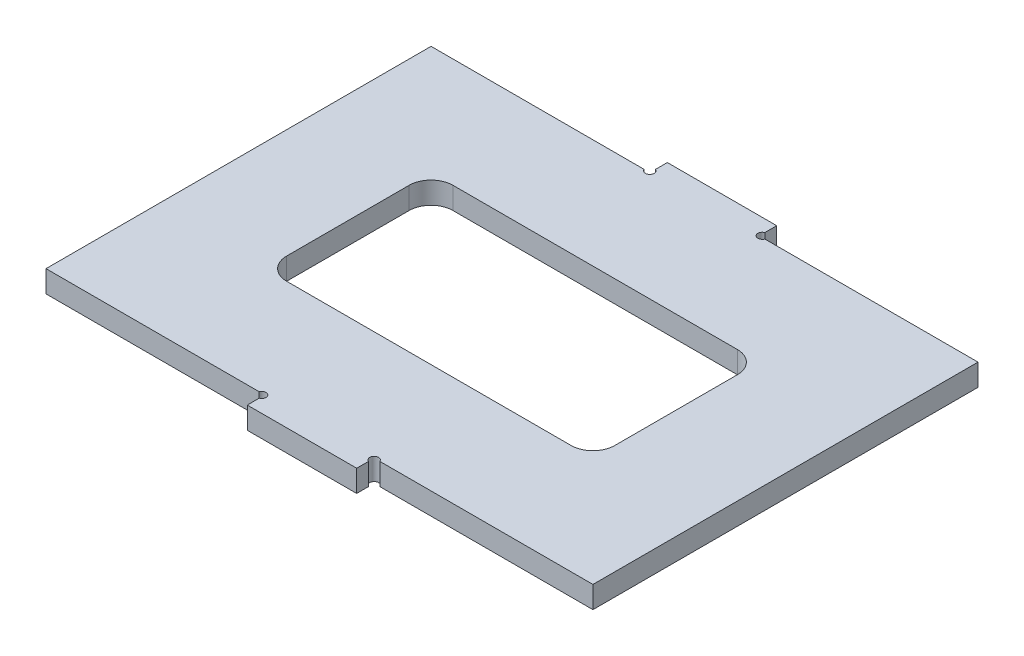
ISO-10303-21;
HEADER;
FILE_DESCRIPTION(('STEP AP214'),'2;1');
FILE_NAME('part.step','',(''),(''),'','','');
FILE_SCHEMA(('AUTOMOTIVE_DESIGN { 1 0 10303 214 1 1 1 1 }'));
ENDSEC;
DATA;
#1=APPLICATION_CONTEXT('core data for automotive mechanical design processes');
#2=APPLICATION_PROTOCOL_DEFINITION('international standard','automotive_design',2000,#1);
#3=PRODUCT_CONTEXT('',#1,'mechanical');
#4=PRODUCT('Part','Part','',(#3));
#5=PRODUCT_RELATED_PRODUCT_CATEGORY('part','',(#4));
#6=PRODUCT_DEFINITION_FORMATION('','',#4);
#7=PRODUCT_DEFINITION_CONTEXT('part definition',#1,'design');
#8=PRODUCT_DEFINITION('design','',#6,#7);
#9=PRODUCT_DEFINITION_SHAPE('','',#8);
#10=(LENGTH_UNIT() NAMED_UNIT(*) SI_UNIT(.MILLI.,.METRE.));
#11=(NAMED_UNIT(*) PLANE_ANGLE_UNIT() SI_UNIT($,.RADIAN.));
#12=(NAMED_UNIT(*) SI_UNIT($,.STERADIAN.) SOLID_ANGLE_UNIT());
#13=UNCERTAINTY_MEASURE_WITH_UNIT(LENGTH_MEASURE(1.E-05),#10,'distance_accuracy_value','');
#14=(GEOMETRIC_REPRESENTATION_CONTEXT(3) GLOBAL_UNCERTAINTY_ASSIGNED_CONTEXT((#13)) GLOBAL_UNIT_ASSIGNED_CONTEXT((#10,
#11,#12)) REPRESENTATION_CONTEXT('',''));
#15=CARTESIAN_POINT('',(0.,0.,0.));
#16=DIRECTION('',(0.,0.,1.));
#17=DIRECTION('',(1.,0.,0.));
#18=AXIS2_PLACEMENT_3D('',#15,#16,#17);
#19=CARTESIAN_POINT('',(-125.,-10.,88.));
#20=DIRECTION('',(0.,0.,1.));
#21=DIRECTION('',(1.,0.,0.));
#22=AXIS2_PLACEMENT_3D('',#19,#20,#21);
#23=PLANE('',#22);
#24=DIRECTION('',(1.,0.,0.));
#25=VECTOR('',#24,1.);
#26=CARTESIAN_POINT('',(-125.,-10.,88.));
#27=LINE('',#26,#25);
#28=CARTESIAN_POINT('',(-125.,-10.,88.));
#29=VERTEX_POINT('',#28);
#30=CARTESIAN_POINT('',(-27.5779354745736,-10.,88.));
#31=VERTEX_POINT('',#30);
#32=EDGE_CURVE('E248',#29,#31,#27,.T.);
#33=ORIENTED_EDGE('',*,*,#32,.T.);
#34=DIRECTION('',(0.,1.,0.));
#35=VECTOR('',#34,1.);
#36=CARTESIAN_POINT('',(-27.5779354745736,0.,88.));
#37=LINE('',#36,#35);
#38=CARTESIAN_POINT('',(-27.5779354745736,0.,88.));
#39=VERTEX_POINT('',#38);
#40=EDGE_CURVE('E314',#39,#31,#37,.F.);
#41=ORIENTED_EDGE('',*,*,#40,.F.);
#42=DIRECTION('',(1.,0.,0.));
#43=VECTOR('',#42,1.);
#44=CARTESIAN_POINT('',(-125.,0.,88.));
#45=LINE('',#44,#43);
#46=CARTESIAN_POINT('',(-125.,0.,88.));
#47=VERTEX_POINT('',#46);
#48=EDGE_CURVE('E229',#47,#39,#45,.T.);
#49=ORIENTED_EDGE('',*,*,#48,.F.);
#50=DIRECTION('',(0.,1.,0.));
#51=VECTOR('',#50,1.);
#52=CARTESIAN_POINT('',(-125.,-10.,88.));
#53=LINE('',#52,#51);
#54=EDGE_CURVE('E241',#29,#47,#53,.T.);
#55=ORIENTED_EDGE('',*,*,#54,.F.);
#56=EDGE_LOOP('',(#33,#41,#49,#55));
#57=FACE_BOUND('',#56,.T.);
#58=ADVANCED_FACE('F42',(#57),#23,.T.);
#59=CARTESIAN_POINT('',(-125.,-10.,-88.));
#60=DIRECTION('',(0.,0.,-1.));
#61=DIRECTION('',(-1.,0.,0.));
#62=AXIS2_PLACEMENT_3D('',#59,#60,#61);
#63=PLANE('',#62);
#64=DIRECTION('',(-1.,0.,0.));
#65=VECTOR('',#64,1.);
#66=CARTESIAN_POINT('',(-125.,-10.,-88.));
#67=LINE('',#66,#65);
#68=CARTESIAN_POINT('',(125.,-10.,-88.));
#69=VERTEX_POINT('',#68);
#70=CARTESIAN_POINT('',(27.5779354745735,-10.,-88.));
#71=VERTEX_POINT('',#70);
#72=EDGE_CURVE('E386',#69,#71,#67,.T.);
#73=ORIENTED_EDGE('',*,*,#72,.T.);
#74=DIRECTION('',(0.,1.,0.));
#75=VECTOR('',#74,1.);
#76=CARTESIAN_POINT('',(27.5779354745735,0.,-88.));
#77=LINE('',#76,#75);
#78=CARTESIAN_POINT('',(27.5779354745735,0.,-88.));
#79=VERTEX_POINT('',#78);
#80=EDGE_CURVE('E340',#79,#71,#77,.F.);
#81=ORIENTED_EDGE('',*,*,#80,.F.);
#82=DIRECTION('',(-1.,0.,0.));
#83=VECTOR('',#82,1.);
#84=CARTESIAN_POINT('',(-125.,0.,-88.));
#85=LINE('',#84,#83);
#86=CARTESIAN_POINT('',(125.,0.,-88.));
#87=VERTEX_POINT('',#86);
#88=EDGE_CURVE('E235',#87,#79,#85,.T.);
#89=ORIENTED_EDGE('',*,*,#88,.F.);
#90=DIRECTION('',(0.,1.,0.));
#91=VECTOR('',#90,1.);
#92=CARTESIAN_POINT('',(125.,-10.,-88.));
#93=LINE('',#92,#91);
#94=EDGE_CURVE('E246',#69,#87,#93,.T.);
#95=ORIENTED_EDGE('',*,*,#94,.F.);
#96=EDGE_LOOP('',(#73,#81,#89,#95));
#97=FACE_BOUND('',#96,.T.);
#98=ADVANCED_FACE('F436',(#97),#63,.T.);
#99=CARTESIAN_POINT('',(27.5779354745735,0.,88.));
#100=VERTEX_POINT('',#99);
#101=CARTESIAN_POINT('',(125.,0.,88.));
#102=VERTEX_POINT('',#101);
#103=EDGE_CURVE('E219',#100,#102,#45,.T.);
#104=ORIENTED_EDGE('',*,*,#103,.F.);
#105=DIRECTION('',(0.,-1.,0.));
#106=VECTOR('',#105,1.);
#107=CARTESIAN_POINT('',(27.5779354745736,-10.,88.));
#108=LINE('',#107,#106);
#109=CARTESIAN_POINT('',(27.5779354745736,-10.,88.));
#110=VERTEX_POINT('',#109);
#111=EDGE_CURVE('E202',#110,#100,#108,.F.);
#112=ORIENTED_EDGE('',*,*,#111,.F.);
#113=CARTESIAN_POINT('',(125.,-10.,88.));
#114=VERTEX_POINT('',#113);
#115=EDGE_CURVE('E392',#110,#114,#27,.T.);
#116=ORIENTED_EDGE('',*,*,#115,.T.);
#117=DIRECTION('',(0.,1.,0.));
#118=VECTOR('',#117,1.);
#119=CARTESIAN_POINT('',(125.,-10.,88.));
#120=LINE('',#119,#118);
#121=EDGE_CURVE('E227',#114,#102,#120,.T.);
#122=ORIENTED_EDGE('',*,*,#121,.T.);
#123=EDGE_LOOP('',(#104,#112,#116,#122));
#124=FACE_BOUND('',#123,.T.);
#125=ADVANCED_FACE('F225',(#124),#23,.T.);
#126=CARTESIAN_POINT('',(-27.5779354745736,0.,-88.));
#127=VERTEX_POINT('',#126);
#128=CARTESIAN_POINT('',(-125.,0.,-88.));
#129=VERTEX_POINT('',#128);
#130=EDGE_CURVE('E395',#127,#129,#85,.T.);
#131=ORIENTED_EDGE('',*,*,#130,.F.);
#132=DIRECTION('',(0.,-1.,0.));
#133=VECTOR('',#132,1.);
#134=CARTESIAN_POINT('',(-27.5779354745736,-10.,-88.));
#135=LINE('',#134,#133);
#136=CARTESIAN_POINT('',(-27.5779354745736,-10.,-88.));
#137=VERTEX_POINT('',#136);
#138=EDGE_CURVE('E329',#137,#127,#135,.F.);
#139=ORIENTED_EDGE('',*,*,#138,.F.);
#140=CARTESIAN_POINT('',(-125.,-10.,-88.));
#141=VERTEX_POINT('',#140);
#142=EDGE_CURVE('E385',#137,#141,#67,.T.);
#143=ORIENTED_EDGE('',*,*,#142,.T.);
#144=DIRECTION('',(0.,1.,0.));
#145=VECTOR('',#144,1.);
#146=CARTESIAN_POINT('',(-125.,-10.,-88.));
#147=LINE('',#146,#145);
#148=EDGE_CURVE('E243',#141,#129,#147,.T.);
#149=ORIENTED_EDGE('',*,*,#148,.T.);
#150=EDGE_LOOP('',(#131,#139,#143,#149));
#151=FACE_BOUND('',#150,.T.);
#152=ADVANCED_FACE('F406',(#151),#63,.T.);
#153=CARTESIAN_POINT('',(-25.,-10.,-88.));
#154=DIRECTION('',(-1.,0.,0.));
#155=DIRECTION('',(0.,0.,1.));
#156=AXIS2_PLACEMENT_3D('',#153,#154,#155);
#157=PLANE('',#156);
#158=DIRECTION('',(0.,0.,1.));
#159=VECTOR('',#158,1.);
#160=CARTESIAN_POINT('',(-25.,-10.,-88.));
#161=LINE('',#160,#159);
#162=CARTESIAN_POINT('',(-25.,-10.,-96.));
#163=VERTEX_POINT('',#162);
#164=CARTESIAN_POINT('',(-25.,-10.,-90.5779354745735));
#165=VERTEX_POINT('',#164);
#166=EDGE_CURVE('E363',#163,#165,#161,.T.);
#167=ORIENTED_EDGE('',*,*,#166,.T.);
#168=DIRECTION('',(0.,-1.,0.));
#169=VECTOR('',#168,1.);
#170=CARTESIAN_POINT('',(-25.,-10.,-90.5779354745735));
#171=LINE('',#170,#169);
#172=CARTESIAN_POINT('',(-25.,0.,-90.5779354745735));
#173=VERTEX_POINT('',#172);
#174=EDGE_CURVE('E323',#165,#173,#171,.F.);
#175=ORIENTED_EDGE('',*,*,#174,.T.);
#176=DIRECTION('',(0.,0.,1.));
#177=VECTOR('',#176,1.);
#178=CARTESIAN_POINT('',(-25.,0.,-88.));
#179=LINE('',#178,#177);
#180=CARTESIAN_POINT('',(-25.,0.,-96.));
#181=VERTEX_POINT('',#180);
#182=EDGE_CURVE('E356',#181,#173,#179,.T.);
#183=ORIENTED_EDGE('',*,*,#182,.F.);
#184=DIRECTION('',(0.,1.,0.));
#185=VECTOR('',#184,1.);
#186=CARTESIAN_POINT('',(-25.,-10.,-96.));
#187=LINE('',#186,#185);
#188=EDGE_CURVE('E378',#163,#181,#187,.T.);
#189=ORIENTED_EDGE('',*,*,#188,.F.);
#190=EDGE_LOOP('',(#167,#175,#183,#189));
#191=FACE_BOUND('',#190,.T.);
#192=ADVANCED_FACE('F451',(#191),#157,.T.);
#193=CARTESIAN_POINT('',(25.,-10.,-88.));
#194=DIRECTION('',(1.,0.,0.));
#195=DIRECTION('',(0.,0.,-1.));
#196=AXIS2_PLACEMENT_3D('',#193,#194,#195);
#197=PLANE('',#196);
#198=DIRECTION('',(0.,0.,-1.));
#199=VECTOR('',#198,1.);
#200=CARTESIAN_POINT('',(25.,0.,-88.));
#201=LINE('',#200,#199);
#202=CARTESIAN_POINT('',(25.,0.,-90.5779354745735));
#203=VERTEX_POINT('',#202);
#204=CARTESIAN_POINT('',(25.,0.,-96.));
#205=VERTEX_POINT('',#204);
#206=EDGE_CURVE('E374',#203,#205,#201,.T.);
#207=ORIENTED_EDGE('',*,*,#206,.F.);
#208=DIRECTION('',(0.,1.,0.));
#209=VECTOR('',#208,1.);
#210=CARTESIAN_POINT('',(25.,0.,-90.5779354745735));
#211=LINE('',#210,#209);
#212=CARTESIAN_POINT('',(25.,-10.,-90.5779354745735));
#213=VERTEX_POINT('',#212);
#214=EDGE_CURVE('E338',#203,#213,#211,.F.);
#215=ORIENTED_EDGE('',*,*,#214,.T.);
#216=DIRECTION('',(0.,0.,-1.));
#217=VECTOR('',#216,1.);
#218=CARTESIAN_POINT('',(25.,-10.,-88.));
#219=LINE('',#218,#217);
#220=CARTESIAN_POINT('',(25.,-10.,-96.));
#221=VERTEX_POINT('',#220);
#222=EDGE_CURVE('E366',#213,#221,#219,.T.);
#223=ORIENTED_EDGE('',*,*,#222,.T.);
#224=DIRECTION('',(0.,1.,0.));
#225=VECTOR('',#224,1.);
#226=CARTESIAN_POINT('',(25.,-10.,-96.));
#227=LINE('',#226,#225);
#228=EDGE_CURVE('E372',#221,#205,#227,.T.);
#229=ORIENTED_EDGE('',*,*,#228,.T.);
#230=EDGE_LOOP('',(#207,#215,#223,#229));
#231=FACE_BOUND('',#230,.T.);
#232=ADVANCED_FACE('F445',(#231),#197,.T.);
#233=CARTESIAN_POINT('',(25.0000000000001,-10.,88.));
#234=DIRECTION('',(1.,0.,0.));
#235=DIRECTION('',(0.,0.,-1.));
#236=AXIS2_PLACEMENT_3D('',#233,#234,#235);
#237=PLANE('',#236);
#238=DIRECTION('',(0.,0.,-1.));
#239=VECTOR('',#238,1.);
#240=CARTESIAN_POINT('',(25.0000000000001,-10.,88.));
#241=LINE('',#240,#239);
#242=CARTESIAN_POINT('',(25.,-10.,96.));
#243=VERTEX_POINT('',#242);
#244=CARTESIAN_POINT('',(25.,-10.,90.5779354745735));
#245=VERTEX_POINT('',#244);
#246=EDGE_CURVE('E348',#243,#245,#241,.T.);
#247=ORIENTED_EDGE('',*,*,#246,.T.);
#248=DIRECTION('',(0.,-1.,0.));
#249=VECTOR('',#248,1.);
#250=CARTESIAN_POINT('',(25.,-10.,90.5779354745735));
#251=LINE('',#250,#249);
#252=CARTESIAN_POINT('',(25.,0.,90.5779354745735));
#253=VERTEX_POINT('',#252);
#254=EDGE_CURVE('E212',#245,#253,#251,.F.);
#255=ORIENTED_EDGE('',*,*,#254,.T.);
#256=DIRECTION('',(0.,0.,-1.));
#257=VECTOR('',#256,1.);
#258=CARTESIAN_POINT('',(25.0000000000001,0.,88.));
#259=LINE('',#258,#257);
#260=CARTESIAN_POINT('',(25.,0.,96.));
#261=VERTEX_POINT('',#260);
#262=EDGE_CURVE('E223',#261,#253,#259,.T.);
#263=ORIENTED_EDGE('',*,*,#262,.F.);
#264=DIRECTION('',(0.,1.,0.));
#265=VECTOR('',#264,1.);
#266=CARTESIAN_POINT('',(25.,-10.,96.));
#267=LINE('',#266,#265);
#268=EDGE_CURVE('E342',#243,#261,#267,.T.);
#269=ORIENTED_EDGE('',*,*,#268,.F.);
#270=EDGE_LOOP('',(#247,#255,#263,#269));
#271=FACE_BOUND('',#270,.T.);
#272=ADVANCED_FACE('F426',(#271),#237,.T.);
#273=CARTESIAN_POINT('',(-25.,-10.,88.));
#274=DIRECTION('',(-1.,0.,0.));
#275=DIRECTION('',(0.,0.,1.));
#276=AXIS2_PLACEMENT_3D('',#273,#274,#275);
#277=PLANE('',#276);
#278=DIRECTION('',(0.,0.,1.));
#279=VECTOR('',#278,1.);
#280=CARTESIAN_POINT('',(-25.,0.,88.));
#281=LINE('',#280,#279);
#282=CARTESIAN_POINT('',(-25.,0.,90.5779354745735));
#283=VERTEX_POINT('',#282);
#284=CARTESIAN_POINT('',(-25.,0.,96.));
#285=VERTEX_POINT('',#284);
#286=EDGE_CURVE('E354',#283,#285,#281,.T.);
#287=ORIENTED_EDGE('',*,*,#286,.F.);
#288=DIRECTION('',(0.,1.,0.));
#289=VECTOR('',#288,1.);
#290=CARTESIAN_POINT('',(-25.,0.,90.5779354745735));
#291=LINE('',#290,#289);
#292=CARTESIAN_POINT('',(-25.,-10.,90.5779354745735));
#293=VERTEX_POINT('',#292);
#294=EDGE_CURVE('E320',#283,#293,#291,.F.);
#295=ORIENTED_EDGE('',*,*,#294,.T.);
#296=DIRECTION('',(0.,0.,1.));
#297=VECTOR('',#296,1.);
#298=CARTESIAN_POINT('',(-25.,-10.,88.));
#299=LINE('',#298,#297);
#300=CARTESIAN_POINT('',(-25.,-10.,96.));
#301=VERTEX_POINT('',#300);
#302=EDGE_CURVE('E352',#293,#301,#299,.T.);
#303=ORIENTED_EDGE('',*,*,#302,.T.);
#304=DIRECTION('',(0.,1.,0.));
#305=VECTOR('',#304,1.);
#306=CARTESIAN_POINT('',(-25.,-10.,96.));
#307=LINE('',#306,#305);
#308=EDGE_CURVE('E345',#301,#285,#307,.T.);
#309=ORIENTED_EDGE('',*,*,#308,.T.);
#310=EDGE_LOOP('',(#287,#295,#303,#309));
#311=FACE_BOUND('',#310,.T.);
#312=ADVANCED_FACE('F418',(#311),#277,.T.);
#313=CARTESIAN_POINT('',(125.,-10.,-88.));
#314=DIRECTION('',(1.,0.,0.));
#315=DIRECTION('',(0.,0.,-1.));
#316=AXIS2_PLACEMENT_3D('',#313,#314,#315);
#317=PLANE('',#316);
#318=DIRECTION('',(0.,0.,-1.));
#319=VECTOR('',#318,1.);
#320=CARTESIAN_POINT('',(125.,0.,-88.));
#321=LINE('',#320,#319);
#322=EDGE_CURVE('E380',#102,#87,#321,.T.);
#323=ORIENTED_EDGE('',*,*,#322,.F.);
#324=ORIENTED_EDGE('',*,*,#121,.F.);
#325=DIRECTION('',(0.,0.,-1.));
#326=VECTOR('',#325,1.);
#327=CARTESIAN_POINT('',(125.,-10.,-88.));
#328=LINE('',#327,#326);
#329=EDGE_CURVE('E233',#114,#69,#328,.T.);
#330=ORIENTED_EDGE('',*,*,#329,.T.);
#331=ORIENTED_EDGE('',*,*,#94,.T.);
#332=EDGE_LOOP('',(#323,#324,#330,#331));
#333=FACE_BOUND('',#332,.T.);
#334=ADVANCED_FACE('F433',(#333),#317,.T.);
#335=CARTESIAN_POINT('',(-125.,-10.,-88.));
#336=DIRECTION('',(-1.,0.,0.));
#337=DIRECTION('',(0.,0.,1.));
#338=AXIS2_PLACEMENT_3D('',#335,#336,#337);
#339=PLANE('',#338);
#340=DIRECTION('',(0.,0.,1.));
#341=VECTOR('',#340,1.);
#342=CARTESIAN_POINT('',(-125.,0.,-88.));
#343=LINE('',#342,#341);
#344=EDGE_CURVE('E230',#129,#47,#343,.T.);
#345=ORIENTED_EDGE('',*,*,#344,.F.);
#346=ORIENTED_EDGE('',*,*,#148,.F.);
#347=DIRECTION('',(0.,0.,1.));
#348=VECTOR('',#347,1.);
#349=CARTESIAN_POINT('',(-125.,-10.,-88.));
#350=LINE('',#349,#348);
#351=EDGE_CURVE('E389',#141,#29,#350,.T.);
#352=ORIENTED_EDGE('',*,*,#351,.T.);
#353=ORIENTED_EDGE('',*,*,#54,.T.);
#354=EDGE_LOOP('',(#345,#346,#352,#353));
#355=FACE_BOUND('',#354,.T.);
#356=ADVANCED_FACE('F410',(#355),#339,.T.);
#357=CARTESIAN_POINT('',(0.,-10.,0.));
#358=DIRECTION('',(0.,1.,0.));
#359=DIRECTION('',(0.,0.,1.));
#360=AXIS2_PLACEMENT_3D('',#357,#358,#359);
#361=PLANE('',#360);
#362=DIRECTION('',(0.,0.,-1.));
#363=VECTOR('',#362,1.);
#364=CARTESIAN_POINT('',(75.,-10.,-38.));
#365=LINE('',#364,#363);
#366=CARTESIAN_POINT('',(75.,-10.,27.9999999999999));
#367=VERTEX_POINT('',#366);
#368=CARTESIAN_POINT('',(75.,-10.,-28.));
#369=VERTEX_POINT('',#368);
#370=EDGE_CURVE('E299',#367,#369,#365,.T.);
#371=ORIENTED_EDGE('',*,*,#370,.T.);
#372=CARTESIAN_POINT('',(65.,-10.,-28.));
#373=DIRECTION('',(0.,1.,0.));
#374=DIRECTION('',(0.,0.,1.));
#375=AXIS2_PLACEMENT_3D('',#372,#373,#374);
#376=CIRCLE('',#375,10.);
#377=CARTESIAN_POINT('',(65.,-10.,-38.));
#378=VERTEX_POINT('',#377);
#379=EDGE_CURVE('E269',#369,#378,#376,.T.);
#380=ORIENTED_EDGE('',*,*,#379,.T.);
#381=DIRECTION('',(-1.,0.,0.));
#382=VECTOR('',#381,1.);
#383=CARTESIAN_POINT('',(75.,-10.,-38.));
#384=LINE('',#383,#382);
#385=CARTESIAN_POINT('',(-65.,-10.,-38.));
#386=VERTEX_POINT('',#385);
#387=EDGE_CURVE('E304',#378,#386,#384,.T.);
#388=ORIENTED_EDGE('',*,*,#387,.T.);
#389=CARTESIAN_POINT('',(-65.0000000000001,-10.,-28.));
#390=DIRECTION('',(0.,1.,0.));
#391=DIRECTION('',(0.,0.,1.));
#392=AXIS2_PLACEMENT_3D('',#389,#390,#391);
#393=CIRCLE('',#392,10.);
#394=CARTESIAN_POINT('',(-75.0000000000001,-10.,-28.));
#395=VERTEX_POINT('',#394);
#396=EDGE_CURVE('E11',#386,#395,#393,.T.);
#397=ORIENTED_EDGE('',*,*,#396,.T.);
#398=DIRECTION('',(0.,0.,1.));
#399=VECTOR('',#398,1.);
#400=CARTESIAN_POINT('',(-75.0000000000001,-10.,-38.));
#401=LINE('',#400,#399);
#402=CARTESIAN_POINT('',(-75.0000000000001,-10.,27.9999999999999));
#403=VERTEX_POINT('',#402);
#404=EDGE_CURVE('E291',#395,#403,#401,.T.);
#405=ORIENTED_EDGE('',*,*,#404,.T.);
#406=CARTESIAN_POINT('',(-65.,-10.,28.));
#407=DIRECTION('',(0.,1.,0.));
#408=DIRECTION('',(0.,0.,1.));
#409=AXIS2_PLACEMENT_3D('',#406,#407,#408);
#410=CIRCLE('',#409,10.);
#411=CARTESIAN_POINT('',(-65.,-10.,38.));
#412=VERTEX_POINT('',#411);
#413=EDGE_CURVE('E277',#403,#412,#410,.T.);
#414=ORIENTED_EDGE('',*,*,#413,.T.);
#415=DIRECTION('',(1.,0.,0.));
#416=VECTOR('',#415,1.);
#417=CARTESIAN_POINT('',(75.,-10.,38.));
#418=LINE('',#417,#416);
#419=CARTESIAN_POINT('',(65.,-10.,38.));
#420=VERTEX_POINT('',#419);
#421=EDGE_CURVE('E296',#412,#420,#418,.T.);
#422=ORIENTED_EDGE('',*,*,#421,.T.);
#423=CARTESIAN_POINT('',(65.,-10.,28.));
#424=DIRECTION('',(0.,1.,0.));
#425=DIRECTION('',(0.,0.,1.));
#426=AXIS2_PLACEMENT_3D('',#423,#424,#425);
#427=CIRCLE('',#426,10.);
#428=EDGE_CURVE('E273',#420,#367,#427,.T.);
#429=ORIENTED_EDGE('',*,*,#428,.T.);
#430=EDGE_LOOP('',(#371,#380,#388,#397,#405,#414,#422,#429));
#431=FACE_BOUND('',#430,.T.);
#432=CARTESIAN_POINT('',(-25.7071067811866,-10.,-88.7071067811865));
#433=DIRECTION('',(0.,1.,0.));
#434=DIRECTION('',(0.,0.,-1.));
#435=AXIS2_PLACEMENT_3D('',#432,#433,#434);
#436=CIRCLE('',#435,2.);
#437=EDGE_CURVE('E306',#137,#165,#436,.T.);
#438=ORIENTED_EDGE('',*,*,#437,.T.);
#439=ORIENTED_EDGE('',*,*,#166,.F.);
#440=DIRECTION('',(-1.,0.,0.));
#441=VECTOR('',#440,1.);
#442=CARTESIAN_POINT('',(-25.,-10.,-96.));
#443=LINE('',#442,#441);
#444=EDGE_CURVE('E369',#221,#163,#443,.T.);
#445=ORIENTED_EDGE('',*,*,#444,.F.);
#446=ORIENTED_EDGE('',*,*,#222,.F.);
#447=CARTESIAN_POINT('',(25.7071067811866,-10.,-88.7071067811865));
#448=DIRECTION('',(0.,1.,0.));
#449=DIRECTION('',(0.,0.,1.));
#450=AXIS2_PLACEMENT_3D('',#447,#448,#449);
#451=CIRCLE('',#450,2.);
#452=EDGE_CURVE('E335',#213,#71,#451,.T.);
#453=ORIENTED_EDGE('',*,*,#452,.T.);
#454=ORIENTED_EDGE('',*,*,#72,.F.);
#455=ORIENTED_EDGE('',*,*,#329,.F.);
#456=ORIENTED_EDGE('',*,*,#115,.F.);
#457=CARTESIAN_POINT('',(25.7071067811866,-10.,88.7071067811865));
#458=DIRECTION('',(0.,1.,0.));
#459=DIRECTION('',(0.,0.,-1.));
#460=AXIS2_PLACEMENT_3D('',#457,#458,#459);
#461=CIRCLE('',#460,2.);
#462=EDGE_CURVE('E208',#110,#245,#461,.T.);
#463=ORIENTED_EDGE('',*,*,#462,.T.);
#464=ORIENTED_EDGE('',*,*,#246,.F.);
#465=DIRECTION('',(1.,0.,0.));
#466=VECTOR('',#465,1.);
#467=CARTESIAN_POINT('',(-25.,-10.,96.));
#468=LINE('',#467,#466);
#469=EDGE_CURVE('E359',#301,#243,#468,.T.);
#470=ORIENTED_EDGE('',*,*,#469,.F.);
#471=ORIENTED_EDGE('',*,*,#302,.F.);
#472=CARTESIAN_POINT('',(-25.7071067811866,-10.,88.7071067811865));
#473=DIRECTION('',(0.,1.,0.));
#474=DIRECTION('',(0.,0.,1.));
#475=AXIS2_PLACEMENT_3D('',#472,#473,#474);
#476=CIRCLE('',#475,2.);
#477=EDGE_CURVE('E317',#293,#31,#476,.T.);
#478=ORIENTED_EDGE('',*,*,#477,.T.);
#479=ORIENTED_EDGE('',*,*,#32,.F.);
#480=ORIENTED_EDGE('',*,*,#351,.F.);
#481=ORIENTED_EDGE('',*,*,#142,.F.);
#482=EDGE_LOOP('',(#438,#439,#445,#446,#453,#454,#455,#456,#463,#464,#470,#471,#478,#479,#480,#481));
#483=FACE_BOUND('',#482,.T.);
#484=ADVANCED_FACE('F429',(#431,#483),#361,.F.);
#485=CARTESIAN_POINT('',(0.,0.,0.));
#486=DIRECTION('',(0.,1.,0.));
#487=DIRECTION('',(0.,0.,1.));
#488=AXIS2_PLACEMENT_3D('',#485,#486,#487);
#489=PLANE('',#488);
#490=DIRECTION('',(0.,0.,1.));
#491=VECTOR('',#490,1.);
#492=CARTESIAN_POINT('',(-75.0000000000001,0.,-38.));
#493=LINE('',#492,#491);
#494=CARTESIAN_POINT('',(-75.0000000000001,0.,-28.));
#495=VERTEX_POINT('',#494);
#496=CARTESIAN_POINT('',(-75.0000000000001,0.,27.9999999999999));
#497=VERTEX_POINT('',#496);
#498=EDGE_CURVE('E283',#495,#497,#493,.T.);
#499=ORIENTED_EDGE('',*,*,#498,.F.);
#500=CARTESIAN_POINT('',(-65.0000000000001,0.,-28.));
#501=DIRECTION('',(0.,1.,0.));
#502=DIRECTION('',(0.,0.,1.));
#503=AXIS2_PLACEMENT_3D('',#500,#501,#502);
#504=CIRCLE('',#503,10.);
#505=CARTESIAN_POINT('',(-65.,0.,-38.));
#506=VERTEX_POINT('',#505);
#507=EDGE_CURVE('E50',#495,#506,#504,.F.);
#508=ORIENTED_EDGE('',*,*,#507,.T.);
#509=DIRECTION('',(-1.,0.,0.));
#510=VECTOR('',#509,1.);
#511=CARTESIAN_POINT('',(75.,0.,-38.));
#512=LINE('',#511,#510);
#513=CARTESIAN_POINT('',(65.,0.,-38.));
#514=VERTEX_POINT('',#513);
#515=EDGE_CURVE('E282',#514,#506,#512,.T.);
#516=ORIENTED_EDGE('',*,*,#515,.F.);
#517=CARTESIAN_POINT('',(65.,0.,-28.));
#518=DIRECTION('',(0.,1.,0.));
#519=DIRECTION('',(0.,0.,1.));
#520=AXIS2_PLACEMENT_3D('',#517,#518,#519);
#521=CIRCLE('',#520,10.);
#522=CARTESIAN_POINT('',(75.,0.,-28.));
#523=VERTEX_POINT('',#522);
#524=EDGE_CURVE('E267',#514,#523,#521,.F.);
#525=ORIENTED_EDGE('',*,*,#524,.T.);
#526=DIRECTION('',(0.,0.,-1.));
#527=VECTOR('',#526,1.);
#528=CARTESIAN_POINT('',(75.,0.,-38.));
#529=LINE('',#528,#527);
#530=CARTESIAN_POINT('',(75.,0.,27.9999999999999));
#531=VERTEX_POINT('',#530);
#532=EDGE_CURVE('E292',#531,#523,#529,.T.);
#533=ORIENTED_EDGE('',*,*,#532,.F.);
#534=CARTESIAN_POINT('',(65.,0.,28.));
#535=DIRECTION('',(0.,1.,0.));
#536=DIRECTION('',(0.,0.,1.));
#537=AXIS2_PLACEMENT_3D('',#534,#535,#536);
#538=CIRCLE('',#537,10.);
#539=CARTESIAN_POINT('',(65.,0.,38.));
#540=VERTEX_POINT('',#539);
#541=EDGE_CURVE('E271',#531,#540,#538,.F.);
#542=ORIENTED_EDGE('',*,*,#541,.T.);
#543=DIRECTION('',(1.,0.,0.));
#544=VECTOR('',#543,1.);
#545=CARTESIAN_POINT('',(75.,0.,38.));
#546=LINE('',#545,#544);
#547=CARTESIAN_POINT('',(-65.,0.,38.));
#548=VERTEX_POINT('',#547);
#549=EDGE_CURVE('E308',#548,#540,#546,.T.);
#550=ORIENTED_EDGE('',*,*,#549,.F.);
#551=CARTESIAN_POINT('',(-65.,0.,28.));
#552=DIRECTION('',(0.,1.,0.));
#553=DIRECTION('',(0.,0.,1.));
#554=AXIS2_PLACEMENT_3D('',#551,#552,#553);
#555=CIRCLE('',#554,10.);
#556=EDGE_CURVE('E275',#548,#497,#555,.F.);
#557=ORIENTED_EDGE('',*,*,#556,.T.);
#558=EDGE_LOOP('',(#499,#508,#516,#525,#533,#542,#550,#557));
#559=FACE_BOUND('',#558,.T.);
#560=ORIENTED_EDGE('',*,*,#182,.T.);
#561=CARTESIAN_POINT('',(-25.7071067811866,0.,-88.7071067811865));
#562=DIRECTION('',(0.,1.,0.));
#563=DIRECTION('',(0.,0.,1.));
#564=AXIS2_PLACEMENT_3D('',#561,#562,#563);
#565=CIRCLE('',#564,2.);
#566=EDGE_CURVE('E327',#127,#173,#565,.T.);
#567=ORIENTED_EDGE('',*,*,#566,.F.);
#568=ORIENTED_EDGE('',*,*,#130,.T.);
#569=ORIENTED_EDGE('',*,*,#344,.T.);
#570=ORIENTED_EDGE('',*,*,#48,.T.);
#571=CARTESIAN_POINT('',(-25.7071067811866,0.,88.7071067811865));
#572=DIRECTION('',(0.,1.,0.));
#573=DIRECTION('',(0.,0.,1.));
#574=AXIS2_PLACEMENT_3D('',#571,#572,#573);
#575=CIRCLE('',#574,2.);
#576=EDGE_CURVE('E321',#283,#39,#575,.T.);
#577=ORIENTED_EDGE('',*,*,#576,.F.);
#578=ORIENTED_EDGE('',*,*,#286,.T.);
#579=DIRECTION('',(1.,0.,0.));
#580=VECTOR('',#579,1.);
#581=CARTESIAN_POINT('',(-25.,0.,96.));
#582=LINE('',#581,#580);
#583=EDGE_CURVE('E351',#285,#261,#582,.T.);
#584=ORIENTED_EDGE('',*,*,#583,.T.);
#585=ORIENTED_EDGE('',*,*,#262,.T.);
#586=CARTESIAN_POINT('',(25.7071067811866,0.,88.7071067811865));
#587=DIRECTION('',(0.,1.,0.));
#588=DIRECTION('',(0.,0.,1.));
#589=AXIS2_PLACEMENT_3D('',#586,#587,#588);
#590=CIRCLE('',#589,2.);
#591=EDGE_CURVE('E205',#100,#253,#590,.T.);
#592=ORIENTED_EDGE('',*,*,#591,.F.);
#593=ORIENTED_EDGE('',*,*,#103,.T.);
#594=ORIENTED_EDGE('',*,*,#322,.T.);
#595=ORIENTED_EDGE('',*,*,#88,.T.);
#596=CARTESIAN_POINT('',(25.7071067811866,0.,-88.7071067811865));
#597=DIRECTION('',(0.,1.,0.));
#598=DIRECTION('',(0.,0.,1.));
#599=AXIS2_PLACEMENT_3D('',#596,#597,#598);
#600=CIRCLE('',#599,2.);
#601=EDGE_CURVE('E315',#203,#79,#600,.T.);
#602=ORIENTED_EDGE('',*,*,#601,.F.);
#603=ORIENTED_EDGE('',*,*,#206,.T.);
#604=DIRECTION('',(-1.,0.,0.));
#605=VECTOR('',#604,1.);
#606=CARTESIAN_POINT('',(-25.,0.,-96.));
#607=LINE('',#606,#605);
#608=EDGE_CURVE('E367',#205,#181,#607,.T.);
#609=ORIENTED_EDGE('',*,*,#608,.T.);
#610=EDGE_LOOP('',(#560,#567,#568,#569,#570,#577,#578,#584,#585,#592,#593,#594,#595,#602,#603,#609));
#611=FACE_BOUND('',#610,.T.);
#612=ADVANCED_FACE('F217',(#559,#611),#489,.T.);
#613=CARTESIAN_POINT('',(-25.,-10.,-96.));
#614=DIRECTION('',(0.,0.,-1.));
#615=DIRECTION('',(-1.,0.,0.));
#616=AXIS2_PLACEMENT_3D('',#613,#614,#615);
#617=PLANE('',#616);
#618=ORIENTED_EDGE('',*,*,#608,.F.);
#619=ORIENTED_EDGE('',*,*,#228,.F.);
#620=ORIENTED_EDGE('',*,*,#444,.T.);
#621=ORIENTED_EDGE('',*,*,#188,.T.);
#622=EDGE_LOOP('',(#618,#619,#620,#621));
#623=FACE_BOUND('',#622,.T.);
#624=ADVANCED_FACE('F448',(#623),#617,.T.);
#625=CARTESIAN_POINT('',(-25.,-10.,96.));
#626=DIRECTION('',(0.,0.,1.));
#627=DIRECTION('',(1.,0.,0.));
#628=AXIS2_PLACEMENT_3D('',#625,#626,#627);
#629=PLANE('',#628);
#630=ORIENTED_EDGE('',*,*,#583,.F.);
#631=ORIENTED_EDGE('',*,*,#308,.F.);
#632=ORIENTED_EDGE('',*,*,#469,.T.);
#633=ORIENTED_EDGE('',*,*,#268,.T.);
#634=EDGE_LOOP('',(#630,#631,#632,#633));
#635=FACE_BOUND('',#634,.T.);
#636=ADVANCED_FACE('F424',(#635),#629,.T.);
#637=CARTESIAN_POINT('',(-25.7071067811866,0.,88.7071067811865));
#638=DIRECTION('',(0.,1.,0.));
#639=DIRECTION('',(0.,0.,1.));
#640=AXIS2_PLACEMENT_3D('',#637,#638,#639);
#641=CYLINDRICAL_SURFACE('',#640,2.);
#642=ORIENTED_EDGE('',*,*,#576,.T.);
#643=ORIENTED_EDGE('',*,*,#40,.T.);
#644=ORIENTED_EDGE('',*,*,#477,.F.);
#645=ORIENTED_EDGE('',*,*,#294,.F.);
#646=EDGE_LOOP('',(#642,#643,#644,#645));
#647=FACE_BOUND('',#646,.T.);
#648=ADVANCED_FACE('F454',(#647),#641,.F.);
#649=CARTESIAN_POINT('',(25.7071067811866,-10.,88.7071067811865));
#650=DIRECTION('',(0.,1.,0.));
#651=DIRECTION('',(0.,0.,1.));
#652=AXIS2_PLACEMENT_3D('',#649,#650,#651);
#653=CYLINDRICAL_SURFACE('',#652,2.);
#654=ORIENTED_EDGE('',*,*,#254,.F.);
#655=ORIENTED_EDGE('',*,*,#462,.F.);
#656=ORIENTED_EDGE('',*,*,#111,.T.);
#657=ORIENTED_EDGE('',*,*,#591,.T.);
#658=EDGE_LOOP('',(#654,#655,#656,#657));
#659=FACE_BOUND('',#658,.T.);
#660=ADVANCED_FACE('F204',(#659),#653,.F.);
#661=CARTESIAN_POINT('',(25.7071067811866,0.,-88.7071067811865));
#662=DIRECTION('',(0.,1.,0.));
#663=DIRECTION('',(0.,0.,1.));
#664=AXIS2_PLACEMENT_3D('',#661,#662,#663);
#665=CYLINDRICAL_SURFACE('',#664,2.);
#666=ORIENTED_EDGE('',*,*,#601,.T.);
#667=ORIENTED_EDGE('',*,*,#80,.T.);
#668=ORIENTED_EDGE('',*,*,#452,.F.);
#669=ORIENTED_EDGE('',*,*,#214,.F.);
#670=EDGE_LOOP('',(#666,#667,#668,#669));
#671=FACE_BOUND('',#670,.T.);
#672=ADVANCED_FACE('F438',(#671),#665,.F.);
#673=CARTESIAN_POINT('',(-25.7071067811866,-10.,-88.7071067811865));
#674=DIRECTION('',(0.,1.,0.));
#675=DIRECTION('',(0.,0.,1.));
#676=AXIS2_PLACEMENT_3D('',#673,#674,#675);
#677=CYLINDRICAL_SURFACE('',#676,2.);
#678=ORIENTED_EDGE('',*,*,#174,.F.);
#679=ORIENTED_EDGE('',*,*,#437,.F.);
#680=ORIENTED_EDGE('',*,*,#138,.T.);
#681=ORIENTED_EDGE('',*,*,#566,.T.);
#682=EDGE_LOOP('',(#678,#679,#680,#681));
#683=FACE_BOUND('',#682,.T.);
#684=ADVANCED_FACE('F453',(#683),#677,.F.);
#685=CARTESIAN_POINT('',(-75.0000000000001,-10.,-38.));
#686=DIRECTION('',(-1.,0.,0.));
#687=DIRECTION('',(0.,0.,1.));
#688=AXIS2_PLACEMENT_3D('',#685,#686,#687);
#689=PLANE('',#688);
#690=ORIENTED_EDGE('',*,*,#498,.T.);
#691=DIRECTION('',(0.,1.,0.));
#692=VECTOR('',#691,1.);
#693=CARTESIAN_POINT('',(-75.0000000000001,-10.,28.));
#694=LINE('',#693,#692);
#695=EDGE_CURVE('E57',#497,#403,#694,.F.);
#696=ORIENTED_EDGE('',*,*,#695,.T.);
#697=ORIENTED_EDGE('',*,*,#404,.F.);
#698=DIRECTION('',(0.,1.,0.));
#699=VECTOR('',#698,1.);
#700=CARTESIAN_POINT('',(-75.0000000000001,0.,-28.));
#701=LINE('',#700,#699);
#702=EDGE_CURVE('E263',#395,#495,#701,.T.);
#703=ORIENTED_EDGE('',*,*,#702,.T.);
#704=EDGE_LOOP('',(#690,#696,#697,#703));
#705=FACE_BOUND('',#704,.T.);
#706=ADVANCED_FACE('F294',(#705),#689,.F.);
#707=CARTESIAN_POINT('',(75.,-10.,-38.));
#708=DIRECTION('',(0.,0.,-1.));
#709=DIRECTION('',(-1.,0.,0.));
#710=AXIS2_PLACEMENT_3D('',#707,#708,#709);
#711=PLANE('',#710);
#712=ORIENTED_EDGE('',*,*,#387,.F.);
#713=DIRECTION('',(0.,1.,0.));
#714=VECTOR('',#713,1.);
#715=CARTESIAN_POINT('',(65.,0.,-38.));
#716=LINE('',#715,#714);
#717=EDGE_CURVE('E250',#378,#514,#716,.T.);
#718=ORIENTED_EDGE('',*,*,#717,.T.);
#719=ORIENTED_EDGE('',*,*,#515,.T.);
#720=DIRECTION('',(0.,1.,0.));
#721=VECTOR('',#720,1.);
#722=CARTESIAN_POINT('',(-65.0000000000001,-10.,-38.));
#723=LINE('',#722,#721);
#724=EDGE_CURVE('E240',#506,#386,#723,.F.);
#725=ORIENTED_EDGE('',*,*,#724,.T.);
#726=EDGE_LOOP('',(#712,#718,#719,#725));
#727=FACE_BOUND('',#726,.T.);
#728=ADVANCED_FACE('F289',(#727),#711,.F.);
#729=CARTESIAN_POINT('',(75.,-10.,-38.));
#730=DIRECTION('',(1.,0.,0.));
#731=DIRECTION('',(0.,0.,-1.));
#732=AXIS2_PLACEMENT_3D('',#729,#730,#731);
#733=PLANE('',#732);
#734=ORIENTED_EDGE('',*,*,#532,.T.);
#735=DIRECTION('',(0.,1.,0.));
#736=VECTOR('',#735,1.);
#737=CARTESIAN_POINT('',(75.,-10.,-28.));
#738=LINE('',#737,#736);
#739=EDGE_CURVE('E256',#523,#369,#738,.F.);
#740=ORIENTED_EDGE('',*,*,#739,.T.);
#741=ORIENTED_EDGE('',*,*,#370,.F.);
#742=DIRECTION('',(0.,1.,0.));
#743=VECTOR('',#742,1.);
#744=CARTESIAN_POINT('',(75.,0.,28.));
#745=LINE('',#744,#743);
#746=EDGE_CURVE('E253',#367,#531,#745,.T.);
#747=ORIENTED_EDGE('',*,*,#746,.T.);
#748=EDGE_LOOP('',(#734,#740,#741,#747));
#749=FACE_BOUND('',#748,.T.);
#750=ADVANCED_FACE('F509',(#749),#733,.F.);
#751=CARTESIAN_POINT('',(75.,-10.,38.));
#752=DIRECTION('',(0.,0.,1.));
#753=DIRECTION('',(1.,0.,0.));
#754=AXIS2_PLACEMENT_3D('',#751,#752,#753);
#755=PLANE('',#754);
#756=ORIENTED_EDGE('',*,*,#549,.T.);
#757=DIRECTION('',(0.,1.,0.));
#758=VECTOR('',#757,1.);
#759=CARTESIAN_POINT('',(65.,-10.,38.));
#760=LINE('',#759,#758);
#761=EDGE_CURVE('E261',#540,#420,#760,.F.);
#762=ORIENTED_EDGE('',*,*,#761,.T.);
#763=ORIENTED_EDGE('',*,*,#421,.F.);
#764=DIRECTION('',(0.,1.,0.));
#765=VECTOR('',#764,1.);
#766=CARTESIAN_POINT('',(-65.,0.,38.));
#767=LINE('',#766,#765);
#768=EDGE_CURVE('E258',#412,#548,#767,.T.);
#769=ORIENTED_EDGE('',*,*,#768,.T.);
#770=EDGE_LOOP('',(#756,#762,#763,#769));
#771=FACE_BOUND('',#770,.T.);
#772=ADVANCED_FACE('F489',(#771),#755,.F.);
#773=CARTESIAN_POINT('',(65.,-10.,-28.));
#774=DIRECTION('',(0.,-1.,0.));
#775=DIRECTION('',(0.,0.,-1.));
#776=AXIS2_PLACEMENT_3D('',#773,#774,#775);
#777=CYLINDRICAL_SURFACE('',#776,10.);
#778=ORIENTED_EDGE('',*,*,#379,.F.);
#779=ORIENTED_EDGE('',*,*,#739,.F.);
#780=ORIENTED_EDGE('',*,*,#524,.F.);
#781=ORIENTED_EDGE('',*,*,#717,.F.);
#782=EDGE_LOOP('',(#778,#779,#780,#781));
#783=FACE_BOUND('',#782,.T.);
#784=ADVANCED_FACE('F485',(#783),#777,.F.);
#785=CARTESIAN_POINT('',(65.,-10.,28.));
#786=DIRECTION('',(0.,-1.,0.));
#787=DIRECTION('',(0.,0.,-1.));
#788=AXIS2_PLACEMENT_3D('',#785,#786,#787);
#789=CYLINDRICAL_SURFACE('',#788,10.);
#790=ORIENTED_EDGE('',*,*,#428,.F.);
#791=ORIENTED_EDGE('',*,*,#761,.F.);
#792=ORIENTED_EDGE('',*,*,#541,.F.);
#793=ORIENTED_EDGE('',*,*,#746,.F.);
#794=EDGE_LOOP('',(#790,#791,#792,#793));
#795=FACE_BOUND('',#794,.T.);
#796=ADVANCED_FACE('F488',(#795),#789,.F.);
#797=CARTESIAN_POINT('',(-65.,-10.,28.));
#798=DIRECTION('',(0.,-1.,0.));
#799=DIRECTION('',(0.,0.,-1.));
#800=AXIS2_PLACEMENT_3D('',#797,#798,#799);
#801=CYLINDRICAL_SURFACE('',#800,10.);
#802=ORIENTED_EDGE('',*,*,#413,.F.);
#803=ORIENTED_EDGE('',*,*,#695,.F.);
#804=ORIENTED_EDGE('',*,*,#556,.F.);
#805=ORIENTED_EDGE('',*,*,#768,.F.);
#806=EDGE_LOOP('',(#802,#803,#804,#805));
#807=FACE_BOUND('',#806,.T.);
#808=ADVANCED_FACE('F492',(#807),#801,.F.);
#809=CARTESIAN_POINT('',(-65.0000000000001,-10.,-28.));
#810=DIRECTION('',(0.,-1.,0.));
#811=DIRECTION('',(0.,0.,-1.));
#812=AXIS2_PLACEMENT_3D('',#809,#810,#811);
#813=CYLINDRICAL_SURFACE('',#812,10.);
#814=ORIENTED_EDGE('',*,*,#396,.F.);
#815=ORIENTED_EDGE('',*,*,#724,.F.);
#816=ORIENTED_EDGE('',*,*,#507,.F.);
#817=ORIENTED_EDGE('',*,*,#702,.F.);
#818=EDGE_LOOP('',(#814,#815,#816,#817));
#819=FACE_BOUND('',#818,.T.);
#820=ADVANCED_FACE('F44',(#819),#813,.F.);
#821=CLOSED_SHELL('',(#58,#98,#125,#152,#192,#232,#272,#312,#334,#356,#484,#612,#624,#636,#648,
#660,#672,#684,#706,#728,#750,#772,#784,#796,#808,#820));
#822=MANIFOLD_SOLID_BREP('B2',#821);
#823=ADVANCED_BREP_SHAPE_REPRESENTATION('',(#18,#822),#14);
#824=SHAPE_DEFINITION_REPRESENTATION(#9,#823);
ENDSEC;
END-ISO-10303-21;
